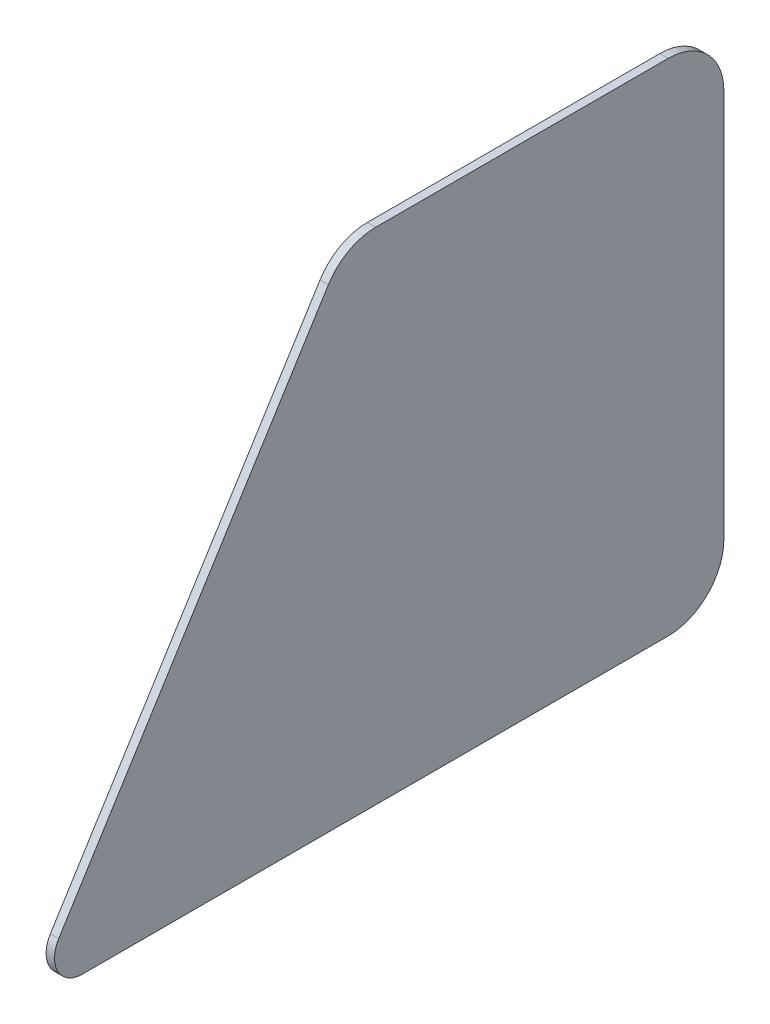
ISO-10303-21;
HEADER;
FILE_DESCRIPTION(('STEP AP214'),'2;1');
FILE_NAME('part.step','',(''),(''),'','','');
FILE_SCHEMA(('AUTOMOTIVE_DESIGN { 1 0 10303 214 1 1 1 1 }'));
ENDSEC;
DATA;
#1=APPLICATION_CONTEXT('core data for automotive mechanical design processes');
#2=APPLICATION_PROTOCOL_DEFINITION('international standard','automotive_design',2000,#1);
#3=PRODUCT_CONTEXT('',#1,'mechanical');
#4=PRODUCT('Part','Part','',(#3));
#5=PRODUCT_RELATED_PRODUCT_CATEGORY('part','',(#4));
#6=PRODUCT_DEFINITION_FORMATION('','',#4);
#7=PRODUCT_DEFINITION_CONTEXT('part definition',#1,'design');
#8=PRODUCT_DEFINITION('design','',#6,#7);
#9=PRODUCT_DEFINITION_SHAPE('','',#8);
#10=(LENGTH_UNIT() NAMED_UNIT(*) SI_UNIT(.MILLI.,.METRE.));
#11=(NAMED_UNIT(*) PLANE_ANGLE_UNIT() SI_UNIT($,.RADIAN.));
#12=(NAMED_UNIT(*) SI_UNIT($,.STERADIAN.) SOLID_ANGLE_UNIT());
#13=UNCERTAINTY_MEASURE_WITH_UNIT(LENGTH_MEASURE(1.E-05),#10,'distance_accuracy_value','');
#14=(GEOMETRIC_REPRESENTATION_CONTEXT(3) GLOBAL_UNCERTAINTY_ASSIGNED_CONTEXT((#13)) GLOBAL_UNIT_ASSIGNED_CONTEXT((#10,
#11,#12)) REPRESENTATION_CONTEXT('',''));
#15=CARTESIAN_POINT('',(0.,0.,0.));
#16=DIRECTION('',(0.,0.,1.));
#17=DIRECTION('',(1.,0.,0.));
#18=AXIS2_PLACEMENT_3D('',#15,#16,#17);
#19=CARTESIAN_POINT('',(3.,9.99999999999995,105.101332547244));
#20=DIRECTION('',(-1.,0.,0.));
#21=DIRECTION('',(0.,0.,1.));
#22=AXIS2_PLACEMENT_3D('',#19,#20,#21);
#23=CYLINDRICAL_SURFACE('',#22,9.99999999999998);
#24=CARTESIAN_POINT('',(0.,9.99999999999995,105.101332547244));
#25=DIRECTION('',(1.,0.,0.));
#26=DIRECTION('',(0.,0.,-1.));
#27=AXIS2_PLACEMENT_3D('',#24,#25,#26);
#28=CIRCLE('',#27,9.99999999999998);
#29=CARTESIAN_POINT('',(0.,15.2999894000316,113.581315587295));
#30=VERTEX_POINT('',#29);
#31=CARTESIAN_POINT('',(0.,0.,105.101332547252));
#32=VERTEX_POINT('',#31);
#33=EDGE_CURVE('E129',#30,#32,#28,.T.);
#34=ORIENTED_EDGE('',*,*,#33,.T.);
#35=DIRECTION('',(-1.,0.,0.));
#36=VECTOR('',#35,1.);
#37=CARTESIAN_POINT('',(3.,0.,105.101332547252));
#38=LINE('',#37,#36);
#39=CARTESIAN_POINT('',(3.,0.,105.101332547252));
#40=VERTEX_POINT('',#39);
#41=EDGE_CURVE('E11',#40,#32,#38,.T.);
#42=ORIENTED_EDGE('',*,*,#41,.F.);
#43=CARTESIAN_POINT('',(3.,9.99999999999995,105.101332547244));
#44=DIRECTION('',(1.,0.,0.));
#45=DIRECTION('',(0.,0.,-1.));
#46=AXIS2_PLACEMENT_3D('',#43,#44,#45);
#47=CIRCLE('',#46,9.99999999999998);
#48=CARTESIAN_POINT('',(3.,15.2999894000316,113.581315587295));
#49=VERTEX_POINT('',#48);
#50=EDGE_CURVE('E143',#49,#40,#47,.T.);
#51=ORIENTED_EDGE('',*,*,#50,.F.);
#52=DIRECTION('',(-1.,0.,0.));
#53=VECTOR('',#52,1.);
#54=CARTESIAN_POINT('',(3.,15.2999894000316,113.581315587295));
#55=LINE('',#54,#53);
#56=EDGE_CURVE('E125',#49,#30,#55,.T.);
#57=ORIENTED_EDGE('',*,*,#56,.T.);
#58=EDGE_LOOP('',(#34,#42,#51,#57));
#59=FACE_BOUND('',#58,.T.);
#60=ADVANCED_FACE('F33',(#59),#23,.T.);
#61=CARTESIAN_POINT('',(3.,0.,105.101332547252));
#62=DIRECTION('',(0.,1.,0.));
#63=DIRECTION('',(0.,0.,1.));
#64=AXIS2_PLACEMENT_3D('',#61,#62,#63);
#65=PLANE('',#64);
#66=DIRECTION('',(0.,0.,-1.));
#67=VECTOR('',#66,1.);
#68=CARTESIAN_POINT('',(0.,0.,105.101332547252));
#69=LINE('',#68,#67);
#70=CARTESIAN_POINT('',(0.,0.,-105.101332547252));
#71=VERTEX_POINT('',#70);
#72=EDGE_CURVE('E132',#32,#71,#69,.T.);
#73=ORIENTED_EDGE('',*,*,#72,.T.);
#74=DIRECTION('',(-1.,0.,0.));
#75=VECTOR('',#74,1.);
#76=CARTESIAN_POINT('',(3.,0.,-105.101332547252));
#77=LINE('',#76,#75);
#78=CARTESIAN_POINT('',(3.,0.,-105.101332547252));
#79=VERTEX_POINT('',#78);
#80=EDGE_CURVE('E41',#79,#71,#77,.T.);
#81=ORIENTED_EDGE('',*,*,#80,.F.);
#82=DIRECTION('',(0.,0.,-1.));
#83=VECTOR('',#82,1.);
#84=CARTESIAN_POINT('',(3.,0.,105.101332547252));
#85=LINE('',#84,#83);
#86=EDGE_CURVE('E92',#40,#79,#85,.T.);
#87=ORIENTED_EDGE('',*,*,#86,.F.);
#88=ORIENTED_EDGE('',*,*,#41,.T.);
#89=EDGE_LOOP('',(#73,#81,#87,#88));
#90=FACE_BOUND('',#89,.T.);
#91=ADVANCED_FACE('F178',(#90),#65,.F.);
#92=CARTESIAN_POINT('',(3.,20.0000000000001,-105.101332547252));
#93=DIRECTION('',(-1.,0.,0.));
#94=DIRECTION('',(0.,0.,1.));
#95=AXIS2_PLACEMENT_3D('',#92,#93,#94);
#96=CYLINDRICAL_SURFACE('',#95,20.);
#97=CARTESIAN_POINT('',(0.,20.0000000000001,-105.101332547252));
#98=DIRECTION('',(1.,0.,0.));
#99=DIRECTION('',(0.,0.,-1.));
#100=AXIS2_PLACEMENT_3D('',#97,#98,#99);
#101=CIRCLE('',#100,20.);
#102=CARTESIAN_POINT('',(0.,20.0000000000001,-125.101332547252));
#103=VERTEX_POINT('',#102);
#104=EDGE_CURVE('E134',#71,#103,#101,.T.);
#105=ORIENTED_EDGE('',*,*,#104,.T.);
#106=DIRECTION('',(-1.,0.,0.));
#107=VECTOR('',#106,1.);
#108=CARTESIAN_POINT('',(3.,20.0000000000001,-125.101332547252));
#109=LINE('',#108,#107);
#110=CARTESIAN_POINT('',(3.,20.0000000000001,-125.101332547252));
#111=VERTEX_POINT('',#110);
#112=EDGE_CURVE('E150',#111,#103,#109,.T.);
#113=ORIENTED_EDGE('',*,*,#112,.F.);
#114=CARTESIAN_POINT('',(3.,20.0000000000001,-105.101332547252));
#115=DIRECTION('',(1.,0.,0.));
#116=DIRECTION('',(0.,0.,-1.));
#117=AXIS2_PLACEMENT_3D('',#114,#115,#116);
#118=CIRCLE('',#117,20.);
#119=EDGE_CURVE('E158',#79,#111,#118,.T.);
#120=ORIENTED_EDGE('',*,*,#119,.F.);
#121=ORIENTED_EDGE('',*,*,#80,.T.);
#122=EDGE_LOOP('',(#105,#113,#120,#121));
#123=FACE_BOUND('',#122,.T.);
#124=ADVANCED_FACE('F156',(#123),#96,.T.);
#125=CARTESIAN_POINT('',(3.,20.0000000000001,-125.101332547252));
#126=DIRECTION('',(0.,0.,1.));
#127=DIRECTION('',(1.,0.,0.));
#128=AXIS2_PLACEMENT_3D('',#125,#126,#127);
#129=PLANE('',#128);
#130=DIRECTION('',(0.,1.,0.));
#131=VECTOR('',#130,1.);
#132=CARTESIAN_POINT('',(0.,20.0000000000001,-125.101332547252));
#133=LINE('',#132,#131);
#134=CARTESIAN_POINT('',(0.,159.5,-125.101332547252));
#135=VERTEX_POINT('',#134);
#136=EDGE_CURVE('E136',#103,#135,#133,.T.);
#137=ORIENTED_EDGE('',*,*,#136,.T.);
#138=DIRECTION('',(-1.,0.,0.));
#139=VECTOR('',#138,1.);
#140=CARTESIAN_POINT('',(3.,159.5,-125.101332547252));
#141=LINE('',#140,#139);
#142=CARTESIAN_POINT('',(3.,159.5,-125.101332547252));
#143=VERTEX_POINT('',#142);
#144=EDGE_CURVE('E147',#143,#135,#141,.T.);
#145=ORIENTED_EDGE('',*,*,#144,.F.);
#146=DIRECTION('',(0.,1.,0.));
#147=VECTOR('',#146,1.);
#148=CARTESIAN_POINT('',(3.,20.0000000000001,-125.101332547252));
#149=LINE('',#148,#147);
#150=EDGE_CURVE('E170',#111,#143,#149,.T.);
#151=ORIENTED_EDGE('',*,*,#150,.F.);
#152=ORIENTED_EDGE('',*,*,#112,.T.);
#153=EDGE_LOOP('',(#137,#145,#151,#152));
#154=FACE_BOUND('',#153,.T.);
#155=ADVANCED_FACE('F166',(#154),#129,.F.);
#156=CARTESIAN_POINT('',(3.,159.5,-105.101332547252));
#157=DIRECTION('',(-1.,0.,0.));
#158=DIRECTION('',(0.,0.,1.));
#159=AXIS2_PLACEMENT_3D('',#156,#157,#158);
#160=CYLINDRICAL_SURFACE('',#159,20.);
#161=CARTESIAN_POINT('',(0.,159.5,-105.101332547252));
#162=DIRECTION('',(1.,0.,0.));
#163=DIRECTION('',(0.,0.,-1.));
#164=AXIS2_PLACEMENT_3D('',#161,#162,#163);
#165=CIRCLE('',#164,20.);
#166=CARTESIAN_POINT('',(0.,179.5,-105.101332547252));
#167=VERTEX_POINT('',#166);
#168=EDGE_CURVE('E138',#135,#167,#165,.T.);
#169=ORIENTED_EDGE('',*,*,#168,.T.);
#170=DIRECTION('',(-1.,0.,0.));
#171=VECTOR('',#170,1.);
#172=CARTESIAN_POINT('',(3.,179.5,-105.101332547252));
#173=LINE('',#172,#171);
#174=CARTESIAN_POINT('',(3.,179.5,-105.101332547252));
#175=VERTEX_POINT('',#174);
#176=EDGE_CURVE('E120',#175,#167,#173,.T.);
#177=ORIENTED_EDGE('',*,*,#176,.F.);
#178=CARTESIAN_POINT('',(3.,159.5,-105.101332547252));
#179=DIRECTION('',(1.,0.,0.));
#180=DIRECTION('',(0.,0.,-1.));
#181=AXIS2_PLACEMENT_3D('',#178,#179,#180);
#182=CIRCLE('',#181,20.);
#183=EDGE_CURVE('E111',#143,#175,#182,.T.);
#184=ORIENTED_EDGE('',*,*,#183,.F.);
#185=ORIENTED_EDGE('',*,*,#144,.T.);
#186=EDGE_LOOP('',(#169,#177,#184,#185));
#187=FACE_BOUND('',#186,.T.);
#188=ADVANCED_FACE('F169',(#187),#160,.T.);
#189=CARTESIAN_POINT('',(3.,179.5,-0.128643867818301));
#190=DIRECTION('',(0.,-1.,0.));
#191=DIRECTION('',(0.,0.,-1.));
#192=AXIS2_PLACEMENT_3D('',#189,#190,#191);
#193=PLANE('',#192);
#194=DIRECTION('',(0.,0.,1.));
#195=VECTOR('',#194,1.);
#196=CARTESIAN_POINT('',(0.,179.5,-0.128643867818301));
#197=LINE('',#196,#195);
#198=CARTESIAN_POINT('',(0.,179.499999999998,-0.128643867818302));
#199=VERTEX_POINT('',#198);
#200=EDGE_CURVE('E119',#167,#199,#197,.T.);
#201=ORIENTED_EDGE('',*,*,#200,.T.);
#202=DIRECTION('',(-1.,0.,0.));
#203=VECTOR('',#202,1.);
#204=CARTESIAN_POINT('',(3.,179.499999999998,-0.128643867818302));
#205=LINE('',#204,#203);
#206=CARTESIAN_POINT('',(3.,179.499999999998,-0.128643867818302));
#207=VERTEX_POINT('',#206);
#208=EDGE_CURVE('E116',#207,#199,#205,.T.);
#209=ORIENTED_EDGE('',*,*,#208,.F.);
#210=DIRECTION('',(0.,0.,1.));
#211=VECTOR('',#210,1.);
#212=CARTESIAN_POINT('',(3.,179.5,-0.128643867818301));
#213=LINE('',#212,#211);
#214=EDGE_CURVE('E105',#175,#207,#213,.T.);
#215=ORIENTED_EDGE('',*,*,#214,.F.);
#216=ORIENTED_EDGE('',*,*,#176,.T.);
#217=EDGE_LOOP('',(#201,#209,#215,#216));
#218=FACE_BOUND('',#217,.T.);
#219=ADVANCED_FACE('F117',(#218),#193,.F.);
#220=CARTESIAN_POINT('',(3.,159.5,-0.128643867818301));
#221=DIRECTION('',(-1.,0.,0.));
#222=DIRECTION('',(0.,0.,1.));
#223=AXIS2_PLACEMENT_3D('',#220,#221,#222);
#224=CYLINDRICAL_SURFACE('',#223,19.9999999999983);
#225=CARTESIAN_POINT('',(0.,159.5,-0.128643867818301));
#226=DIRECTION('',(1.,0.,0.));
#227=DIRECTION('',(0.,0.,-1.));
#228=AXIS2_PLACEMENT_3D('',#225,#226,#227);
#229=CIRCLE('',#228,19.9999999999983);
#230=CARTESIAN_POINT('',(0.,170.099978800065,16.8313222122784));
#231=VERTEX_POINT('',#230);
#232=EDGE_CURVE('E78',#199,#231,#229,.T.);
#233=ORIENTED_EDGE('',*,*,#232,.T.);
#234=DIRECTION('',(-1.,0.,0.));
#235=VECTOR('',#234,1.);
#236=CARTESIAN_POINT('',(3.,170.099978800065,16.8313222122784));
#237=LINE('',#236,#235);
#238=CARTESIAN_POINT('',(3.,170.099978800065,16.8313222122784));
#239=VERTEX_POINT('',#238);
#240=EDGE_CURVE('E121',#239,#231,#237,.T.);
#241=ORIENTED_EDGE('',*,*,#240,.F.);
#242=CARTESIAN_POINT('',(3.,159.5,-0.128643867818301));
#243=DIRECTION('',(1.,0.,0.));
#244=DIRECTION('',(0.,0.,-1.));
#245=AXIS2_PLACEMENT_3D('',#242,#243,#244);
#246=CIRCLE('',#245,19.9999999999983);
#247=EDGE_CURVE('E109',#207,#239,#246,.T.);
#248=ORIENTED_EDGE('',*,*,#247,.F.);
#249=ORIENTED_EDGE('',*,*,#208,.T.);
#250=EDGE_LOOP('',(#233,#241,#248,#249));
#251=FACE_BOUND('',#250,.T.);
#252=ADVANCED_FACE('F123',(#251),#224,.T.);
#253=CARTESIAN_POINT('',(3.,170.099978800065,16.8313222122784));
#254=DIRECTION('',(0.,-0.529998940003161,-0.8479983040051));
#255=DIRECTION('',(0.,0.8479983040051,-0.529998940003161));
#256=AXIS2_PLACEMENT_3D('',#253,#254,#255);
#257=PLANE('',#256);
#258=DIRECTION('',(0.,-0.8479983040051,0.529998940003161));
#259=VECTOR('',#258,1.);
#260=CARTESIAN_POINT('',(0.,170.099978800065,16.8313222122784));
#261=LINE('',#260,#259);
#262=EDGE_CURVE('E84',#231,#30,#261,.T.);
#263=ORIENTED_EDGE('',*,*,#262,.T.);
#264=ORIENTED_EDGE('',*,*,#56,.F.);
#265=DIRECTION('',(0.,-0.8479983040051,0.529998940003161));
#266=VECTOR('',#265,1.);
#267=CARTESIAN_POINT('',(3.,170.099978800065,16.8313222122784));
#268=LINE('',#267,#266);
#269=EDGE_CURVE('E49',#239,#49,#268,.T.);
#270=ORIENTED_EDGE('',*,*,#269,.F.);
#271=ORIENTED_EDGE('',*,*,#240,.T.);
#272=EDGE_LOOP('',(#263,#264,#270,#271));
#273=FACE_BOUND('',#272,.T.);
#274=ADVANCED_FACE('F194',(#273),#257,.F.);
#275=CARTESIAN_POINT('',(3.,9.99999999999995,105.101332547244));
#276=DIRECTION('',(1.,0.,0.));
#277=DIRECTION('',(0.,0.,-1.));
#278=AXIS2_PLACEMENT_3D('',#275,#276,#277);
#279=PLANE('',#278);
#280=ORIENTED_EDGE('',*,*,#50,.T.);
#281=ORIENTED_EDGE('',*,*,#86,.T.);
#282=ORIENTED_EDGE('',*,*,#119,.T.);
#283=ORIENTED_EDGE('',*,*,#150,.T.);
#284=ORIENTED_EDGE('',*,*,#183,.T.);
#285=ORIENTED_EDGE('',*,*,#214,.T.);
#286=ORIENTED_EDGE('',*,*,#247,.T.);
#287=ORIENTED_EDGE('',*,*,#269,.T.);
#288=EDGE_LOOP('',(#280,#281,#282,#283,#284,#285,#286,#287));
#289=FACE_BOUND('',#288,.T.);
#290=ADVANCED_FACE('F107',(#289),#279,.T.);
#291=CARTESIAN_POINT('',(0.,9.99999999999995,105.101332547244));
#292=DIRECTION('',(1.,0.,0.));
#293=DIRECTION('',(0.,0.,-1.));
#294=AXIS2_PLACEMENT_3D('',#291,#292,#293);
#295=PLANE('',#294);
#296=ORIENTED_EDGE('',*,*,#33,.F.);
#297=ORIENTED_EDGE('',*,*,#262,.F.);
#298=ORIENTED_EDGE('',*,*,#232,.F.);
#299=ORIENTED_EDGE('',*,*,#200,.F.);
#300=ORIENTED_EDGE('',*,*,#168,.F.);
#301=ORIENTED_EDGE('',*,*,#136,.F.);
#302=ORIENTED_EDGE('',*,*,#104,.F.);
#303=ORIENTED_EDGE('',*,*,#72,.F.);
#304=EDGE_LOOP('',(#296,#297,#298,#299,#300,#301,#302,#303));
#305=FACE_BOUND('',#304,.T.);
#306=ADVANCED_FACE('F162',(#305),#295,.F.);
#307=CLOSED_SHELL('',(#60,#91,#124,#155,#188,#219,#252,#274,#290,#306));
#308=MANIFOLD_SOLID_BREP('B2',#307);
#309=ADVANCED_BREP_SHAPE_REPRESENTATION('',(#18,#308),#14);
#310=SHAPE_DEFINITION_REPRESENTATION(#9,#309);
ENDSEC;
END-ISO-10303-21;
